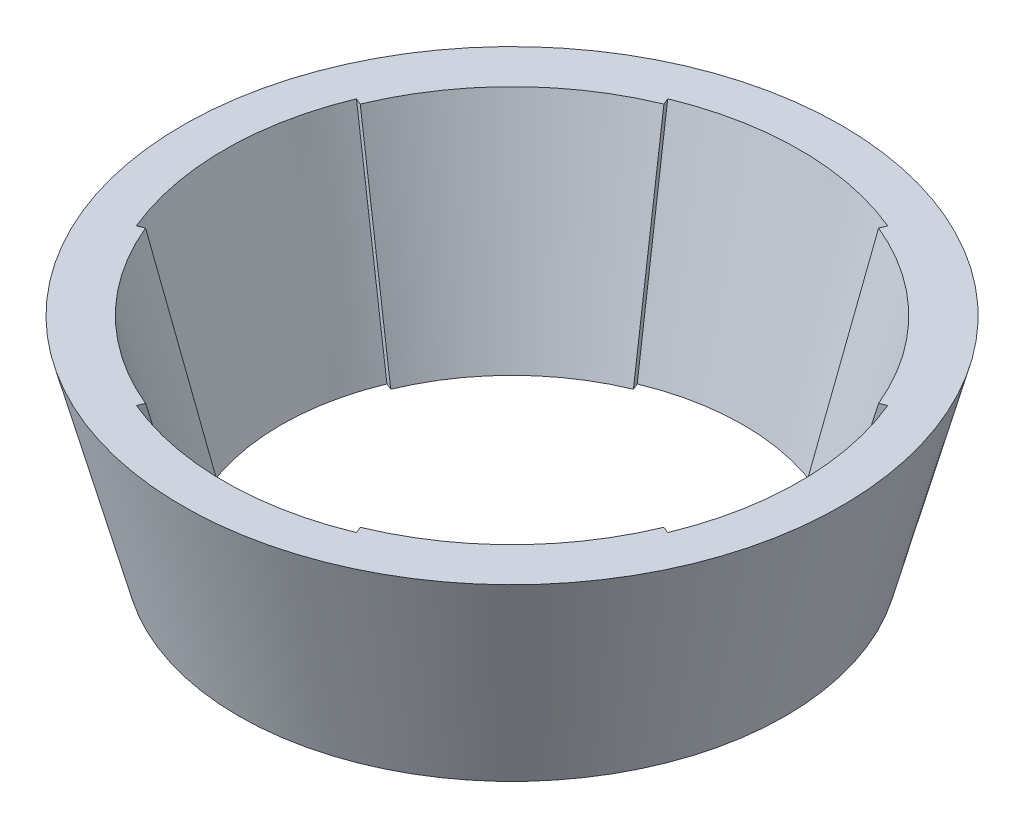
ISO-10303-21;
HEADER;
FILE_DESCRIPTION(('STEP AP214'),'2;1');
FILE_NAME('part.step','',(''),(''),'','','');
FILE_SCHEMA(('AUTOMOTIVE_DESIGN { 1 0 10303 214 1 1 1 1 }'));
ENDSEC;
DATA;
#1=APPLICATION_CONTEXT('core data for automotive mechanical design processes');
#2=APPLICATION_PROTOCOL_DEFINITION('international standard','automotive_design',2000,#1);
#3=PRODUCT_CONTEXT('',#1,'mechanical');
#4=PRODUCT('Part','Part','',(#3));
#5=PRODUCT_RELATED_PRODUCT_CATEGORY('part','',(#4));
#6=PRODUCT_DEFINITION_FORMATION('','',#4);
#7=PRODUCT_DEFINITION_CONTEXT('part definition',#1,'design');
#8=PRODUCT_DEFINITION('design','',#6,#7);
#9=PRODUCT_DEFINITION_SHAPE('','',#8);
#10=(LENGTH_UNIT() NAMED_UNIT(*) SI_UNIT(.MILLI.,.METRE.));
#11=(NAMED_UNIT(*) PLANE_ANGLE_UNIT() SI_UNIT($,.RADIAN.));
#12=(NAMED_UNIT(*) SI_UNIT($,.STERADIAN.) SOLID_ANGLE_UNIT());
#13=UNCERTAINTY_MEASURE_WITH_UNIT(LENGTH_MEASURE(1.E-05),#10,'distance_accuracy_value','');
#14=(GEOMETRIC_REPRESENTATION_CONTEXT(3) GLOBAL_UNCERTAINTY_ASSIGNED_CONTEXT((#13)) GLOBAL_UNIT_ASSIGNED_CONTEXT((#10,
#11,#12)) REPRESENTATION_CONTEXT('',''));
#15=CARTESIAN_POINT('',(0.,0.,0.));
#16=DIRECTION('',(0.,0.,1.));
#17=DIRECTION('',(1.,0.,0.));
#18=AXIS2_PLACEMENT_3D('',#15,#16,#17);
#19=CARTESIAN_POINT('',(49.53,0.,0.));
#20=DIRECTION('',(0.,-1.,0.));
#21=DIRECTION('',(0.,0.,-1.));
#22=AXIS2_PLACEMENT_3D('',#19,#20,#21);
#23=PLANE('',#22);
#24=CARTESIAN_POINT('',(0.,0.,0.));
#25=DIRECTION('',(0.,-1.,0.));
#26=DIRECTION('',(0.,0.,-1.));
#27=AXIS2_PLACEMENT_3D('',#24,#25,#26);
#28=CIRCLE('',#27,49.53);
#29=CARTESIAN_POINT('',(0.,0.,-49.53));
#30=VERTEX_POINT('',#29);
#31=EDGE_CURVE('E190',#30,#30,#28,.T.);
#32=ORIENTED_EDGE('',*,*,#31,.T.);
#33=EDGE_LOOP('',(#32));
#34=FACE_BOUND('',#33,.T.);
#35=CARTESIAN_POINT('',(0.,0.,0.));
#36=DIRECTION('',(0.,-1.,0.));
#37=DIRECTION('',(-1.,0.,0.));
#38=AXIS2_PLACEMENT_3D('',#35,#36,#37);
#39=CIRCLE('',#38,41.91);
#40=CARTESIAN_POINT('',(-16.0382626504205,0.,-38.7197912075482));
#41=VERTEX_POINT('',#40);
#42=CARTESIAN_POINT('',(16.0382626504214,0.,-38.7197912075479));
#43=VERTEX_POINT('',#42);
#44=EDGE_CURVE('E317',#41,#43,#39,.T.);
#45=ORIENTED_EDGE('',*,*,#44,.F.);
#46=DIRECTION('',(-0.382683432365081,0.,-0.923879532511291));
#47=VECTOR('',#46,1.);
#48=CARTESIAN_POINT('',(-15.5522546913169,0.,-37.5464642012589));
#49=LINE('',#48,#47);
#50=CARTESIAN_POINT('',(-15.5522546913169,0.,-37.5464642012589));
#51=VERTEX_POINT('',#50);
#52=EDGE_CURVE('E316',#51,#41,#49,.T.);
#53=ORIENTED_EDGE('',*,*,#52,.F.);
#54=CARTESIAN_POINT('',(0.,0.,0.));
#55=DIRECTION('',(0.,-1.,0.));
#56=DIRECTION('',(0.,0.,-1.));
#57=AXIS2_PLACEMENT_3D('',#54,#55,#56);
#58=CIRCLE('',#57,40.64);
#59=CARTESIAN_POINT('',(-37.5464642012587,0.,-15.5522546913173));
#60=VERTEX_POINT('',#59);
#61=EDGE_CURVE('E196',#60,#51,#58,.T.);
#62=ORIENTED_EDGE('',*,*,#61,.F.);
#63=DIRECTION('',(-0.923879532511287,0.,-0.382683432365091));
#64=VECTOR('',#63,1.);
#65=CARTESIAN_POINT('',(-37.5464642012587,0.,-15.5522546913173));
#66=LINE('',#65,#64);
#67=CARTESIAN_POINT('',(-38.719791207548,0.,-16.038262650421));
#68=VERTEX_POINT('',#67);
#69=EDGE_CURVE('E73',#60,#68,#66,.T.);
#70=ORIENTED_EDGE('',*,*,#69,.T.);
#71=CARTESIAN_POINT('',(0.,0.,0.));
#72=DIRECTION('',(0.,-1.,0.));
#73=DIRECTION('',(0.,0.,1.));
#74=AXIS2_PLACEMENT_3D('',#71,#72,#73);
#75=CIRCLE('',#74,41.91);
#76=CARTESIAN_POINT('',(-38.719791207548,0.,16.038262650421));
#77=VERTEX_POINT('',#76);
#78=EDGE_CURVE('E227',#77,#68,#75,.T.);
#79=ORIENTED_EDGE('',*,*,#78,.F.);
#80=DIRECTION('',(-0.923879532511287,0.,0.382683432365091));
#81=VECTOR('',#80,1.);
#82=CARTESIAN_POINT('',(-37.5464642012587,0.,15.5522546913173));
#83=LINE('',#82,#81);
#84=CARTESIAN_POINT('',(-37.5464642012587,0.,15.5522546913173));
#85=VERTEX_POINT('',#84);
#86=EDGE_CURVE('E215',#85,#77,#83,.T.);
#87=ORIENTED_EDGE('',*,*,#86,.F.);
#88=CARTESIAN_POINT('',(-15.5522546913174,0.,37.5464642012586));
#89=VERTEX_POINT('',#88);
#90=EDGE_CURVE('E57',#89,#85,#58,.T.);
#91=ORIENTED_EDGE('',*,*,#90,.F.);
#92=DIRECTION('',(-0.382683432365094,0.,0.923879532511285));
#93=VECTOR('',#92,1.);
#94=CARTESIAN_POINT('',(-15.5522546913174,0.,37.5464642012586));
#95=LINE('',#94,#93);
#96=CARTESIAN_POINT('',(-16.0382626504211,0.,38.719791207548));
#97=VERTEX_POINT('',#96);
#98=EDGE_CURVE('E231',#89,#97,#95,.T.);
#99=ORIENTED_EDGE('',*,*,#98,.T.);
#100=CARTESIAN_POINT('',(0.,0.,0.));
#101=DIRECTION('',(0.,-1.,0.));
#102=DIRECTION('',(1.,0.,0.));
#103=AXIS2_PLACEMENT_3D('',#100,#101,#102);
#104=CIRCLE('',#103,41.91);
#105=CARTESIAN_POINT('',(16.0382626504208,0.,38.7197912075481));
#106=VERTEX_POINT('',#105);
#107=EDGE_CURVE('E248',#106,#97,#104,.T.);
#108=ORIENTED_EDGE('',*,*,#107,.F.);
#109=DIRECTION('',(0.382683432365088,0.,0.923879532511288));
#110=VECTOR('',#109,1.);
#111=CARTESIAN_POINT('',(15.5522546913172,0.,37.5464642012588));
#112=LINE('',#111,#110);
#113=CARTESIAN_POINT('',(15.5522546913172,0.,37.5464642012588));
#114=VERTEX_POINT('',#113);
#115=EDGE_CURVE('E241',#114,#106,#112,.T.);
#116=ORIENTED_EDGE('',*,*,#115,.F.);
#117=CARTESIAN_POINT('',(37.5464642012587,0.,15.5522546913173));
#118=VERTEX_POINT('',#117);
#119=EDGE_CURVE('E13',#118,#114,#58,.T.);
#120=ORIENTED_EDGE('',*,*,#119,.F.);
#121=DIRECTION('',(0.923879532511287,0.,0.382683432365091));
#122=VECTOR('',#121,1.);
#123=CARTESIAN_POINT('',(37.5464642012587,0.,15.5522546913173));
#124=LINE('',#123,#122);
#125=CARTESIAN_POINT('',(38.719791207548,0.,16.038262650421));
#126=VERTEX_POINT('',#125);
#127=EDGE_CURVE('E255',#118,#126,#124,.T.);
#128=ORIENTED_EDGE('',*,*,#127,.T.);
#129=CARTESIAN_POINT('',(0.,0.,0.));
#130=DIRECTION('',(0.,-1.,0.));
#131=DIRECTION('',(0.,0.,-1.));
#132=AXIS2_PLACEMENT_3D('',#129,#130,#131);
#133=CIRCLE('',#132,41.91);
#134=CARTESIAN_POINT('',(38.719791207548,0.,-16.038262650421));
#135=VERTEX_POINT('',#134);
#136=EDGE_CURVE('E272',#135,#126,#133,.T.);
#137=ORIENTED_EDGE('',*,*,#136,.F.);
#138=DIRECTION('',(0.923879532511287,0.,-0.382683432365091));
#139=VECTOR('',#138,1.);
#140=CARTESIAN_POINT('',(37.5464642012587,0.,-15.5522546913173));
#141=LINE('',#140,#139);
#142=CARTESIAN_POINT('',(37.5464642012587,0.,-15.5522546913173));
#143=VERTEX_POINT('',#142);
#144=EDGE_CURVE('E264',#143,#135,#141,.T.);
#145=ORIENTED_EDGE('',*,*,#144,.F.);
#146=CARTESIAN_POINT('',(15.5522546913177,0.,-37.5464642012585));
#147=VERTEX_POINT('',#146);
#148=EDGE_CURVE('E58',#147,#143,#58,.T.);
#149=ORIENTED_EDGE('',*,*,#148,.F.);
#150=DIRECTION('',(0.3826834323651,0.,-0.923879532511283));
#151=VECTOR('',#150,1.);
#152=CARTESIAN_POINT('',(15.5522546913177,0.,-37.5464642012585));
#153=LINE('',#152,#151);
#154=EDGE_CURVE('E65',#147,#43,#153,.T.);
#155=ORIENTED_EDGE('',*,*,#154,.T.);
#156=EDGE_LOOP('',(#45,#53,#62,#70,#79,#87,#91,#99,#108,#116,#120,#128,#137,#145,#149,#155));
#157=FACE_BOUND('',#156,.T.);
#158=ADVANCED_FACE('F50',(#34,#157),#23,.T.);
#159=CARTESIAN_POINT('',(50.8488642316259,38.1,0.));
#160=DIRECTION('',(0.,1.,0.));
#161=DIRECTION('',(0.,0.,1.));
#162=AXIS2_PLACEMENT_3D('',#159,#160,#161);
#163=PLANE('',#162);
#164=CARTESIAN_POINT('',(0.,38.1,0.));
#165=DIRECTION('',(0.,-1.,0.));
#166=DIRECTION('',(0.,0.,-1.));
#167=AXIS2_PLACEMENT_3D('',#164,#165,#166);
#168=CIRCLE('',#167,59.7388642316259);
#169=CARTESIAN_POINT('',(0.,38.1,-59.7388642316259));
#170=VERTEX_POINT('',#169);
#171=EDGE_CURVE('E186',#170,#170,#168,.T.);
#172=ORIENTED_EDGE('',*,*,#171,.F.);
#173=EDGE_LOOP('',(#172));
#174=FACE_BOUND('',#173,.T.);
#175=CARTESIAN_POINT('',(0.,38.1,0.));
#176=DIRECTION('',(0.,-1.,0.));
#177=DIRECTION('',(0.,0.,-1.));
#178=AXIS2_PLACEMENT_3D('',#175,#176,#177);
#179=CIRCLE('',#178,50.8488642316259);
#180=CARTESIAN_POINT('',(-46.9782249150445,38.1,-19.4590178960251));
#181=VERTEX_POINT('',#180);
#182=CARTESIAN_POINT('',(-19.4590178960246,38.1,-46.9782249150447));
#183=VERTEX_POINT('',#182);
#184=EDGE_CURVE('E185',#181,#183,#179,.T.);
#185=ORIENTED_EDGE('',*,*,#184,.T.);
#186=DIRECTION('',(0.382683432365081,0.,0.923879532511291));
#187=VECTOR('',#186,1.);
#188=CARTESIAN_POINT('',(-19.9450258551283,38.1,-48.151551921334));
#189=LINE('',#188,#187);
#190=CARTESIAN_POINT('',(-19.9450258551283,38.1,-48.151551921334));
#191=VERTEX_POINT('',#190);
#192=EDGE_CURVE('E324',#191,#183,#189,.T.);
#193=ORIENTED_EDGE('',*,*,#192,.F.);
#194=CARTESIAN_POINT('',(0.,38.1,0.));
#195=DIRECTION('',(0.,-1.,0.));
#196=DIRECTION('',(-1.,0.,0.));
#197=AXIS2_PLACEMENT_3D('',#194,#195,#196);
#198=CIRCLE('',#197,52.118864231626);
#199=CARTESIAN_POINT('',(19.9450258551293,38.1,-48.1515519213336));
#200=VERTEX_POINT('',#199);
#201=EDGE_CURVE('E179',#191,#200,#198,.T.);
#202=ORIENTED_EDGE('',*,*,#201,.T.);
#203=DIRECTION('',(-0.3826834323651,0.,0.923879532511283));
#204=VECTOR('',#203,1.);
#205=CARTESIAN_POINT('',(19.9450258551293,38.1,-48.1515519213336));
#206=LINE('',#205,#204);
#207=CARTESIAN_POINT('',(19.4590178960256,38.1,-46.9782249150443));
#208=VERTEX_POINT('',#207);
#209=EDGE_CURVE('E165',#200,#208,#206,.T.);
#210=ORIENTED_EDGE('',*,*,#209,.T.);
#211=CARTESIAN_POINT('',(46.9782249150445,38.1,-19.4590178960251));
#212=VERTEX_POINT('',#211);
#213=EDGE_CURVE('E176',#208,#212,#179,.T.);
#214=ORIENTED_EDGE('',*,*,#213,.T.);
#215=DIRECTION('',(-0.923879532511287,0.,0.382683432365091));
#216=VECTOR('',#215,1.);
#217=CARTESIAN_POINT('',(48.1515519213338,38.1,-19.9450258551288));
#218=LINE('',#217,#216);
#219=CARTESIAN_POINT('',(48.1515519213338,38.1,-19.9450258551288));
#220=VERTEX_POINT('',#219);
#221=EDGE_CURVE('E261',#220,#212,#218,.T.);
#222=ORIENTED_EDGE('',*,*,#221,.F.);
#223=CARTESIAN_POINT('',(0.,38.1,0.));
#224=DIRECTION('',(0.,-1.,0.));
#225=DIRECTION('',(0.,0.,-1.));
#226=AXIS2_PLACEMENT_3D('',#223,#224,#225);
#227=CIRCLE('',#226,52.118864231626);
#228=CARTESIAN_POINT('',(48.1515519213338,38.1,19.9450258551288));
#229=VERTEX_POINT('',#228);
#230=EDGE_CURVE('E269',#220,#229,#227,.T.);
#231=ORIENTED_EDGE('',*,*,#230,.T.);
#232=DIRECTION('',(-0.923879532511287,0.,-0.382683432365091));
#233=VECTOR('',#232,1.);
#234=CARTESIAN_POINT('',(48.1515519213338,38.1,19.9450258551288));
#235=LINE('',#234,#233);
#236=CARTESIAN_POINT('',(46.9782249150444,38.1,19.4590178960251));
#237=VERTEX_POINT('',#236);
#238=EDGE_CURVE('E250',#229,#237,#235,.T.);
#239=ORIENTED_EDGE('',*,*,#238,.T.);
#240=CARTESIAN_POINT('',(19.4590178960249,38.1,46.9782249150445));
#241=VERTEX_POINT('',#240);
#242=EDGE_CURVE('E187',#237,#241,#179,.T.);
#243=ORIENTED_EDGE('',*,*,#242,.T.);
#244=DIRECTION('',(-0.382683432365088,0.,-0.923879532511288));
#245=VECTOR('',#244,1.);
#246=CARTESIAN_POINT('',(19.9450258551286,38.1,48.1515519213339));
#247=LINE('',#246,#245);
#248=CARTESIAN_POINT('',(19.9450258551286,38.1,48.1515519213339));
#249=VERTEX_POINT('',#248);
#250=EDGE_CURVE('E237',#249,#241,#247,.T.);
#251=ORIENTED_EDGE('',*,*,#250,.F.);
#252=CARTESIAN_POINT('',(0.,38.1,0.));
#253=DIRECTION('',(0.,-1.,0.));
#254=DIRECTION('',(1.,0.,0.));
#255=AXIS2_PLACEMENT_3D('',#252,#253,#254);
#256=CIRCLE('',#255,52.118864231626);
#257=CARTESIAN_POINT('',(-19.9450258551289,38.1,48.1515519213337));
#258=VERTEX_POINT('',#257);
#259=EDGE_CURVE('E246',#249,#258,#256,.T.);
#260=ORIENTED_EDGE('',*,*,#259,.T.);
#261=DIRECTION('',(0.382683432365094,0.,-0.923879532511285));
#262=VECTOR('',#261,1.);
#263=CARTESIAN_POINT('',(-19.9450258551289,38.1,48.1515519213337));
#264=LINE('',#263,#262);
#265=CARTESIAN_POINT('',(-19.4590178960253,38.1,46.9782249150444));
#266=VERTEX_POINT('',#265);
#267=EDGE_CURVE('E204',#258,#266,#264,.T.);
#268=ORIENTED_EDGE('',*,*,#267,.T.);
#269=CARTESIAN_POINT('',(-46.9782249150445,38.1,19.4590178960251));
#270=VERTEX_POINT('',#269);
#271=EDGE_CURVE('E188',#266,#270,#179,.T.);
#272=ORIENTED_EDGE('',*,*,#271,.T.);
#273=DIRECTION('',(0.923879532511287,0.,-0.382683432365091));
#274=VECTOR('',#273,1.);
#275=CARTESIAN_POINT('',(-48.1515519213338,38.1,19.9450258551288));
#276=LINE('',#275,#274);
#277=CARTESIAN_POINT('',(-48.1515519213338,38.1,19.9450258551288));
#278=VERTEX_POINT('',#277);
#279=EDGE_CURVE('E202',#278,#270,#276,.T.);
#280=ORIENTED_EDGE('',*,*,#279,.F.);
#281=CARTESIAN_POINT('',(0.,38.1,0.));
#282=DIRECTION('',(0.,-1.,0.));
#283=DIRECTION('',(0.,0.,1.));
#284=AXIS2_PLACEMENT_3D('',#281,#282,#283);
#285=CIRCLE('',#284,52.118864231626);
#286=CARTESIAN_POINT('',(-48.1515519213338,38.1,-19.9450258551288));
#287=VERTEX_POINT('',#286);
#288=EDGE_CURVE('E225',#278,#287,#285,.T.);
#289=ORIENTED_EDGE('',*,*,#288,.T.);
#290=DIRECTION('',(0.923879532511287,0.,0.382683432365091));
#291=VECTOR('',#290,1.);
#292=CARTESIAN_POINT('',(-48.1515519213338,38.1,-19.9450258551288));
#293=LINE('',#292,#291);
#294=EDGE_CURVE('E330',#287,#181,#293,.T.);
#295=ORIENTED_EDGE('',*,*,#294,.T.);
#296=EDGE_LOOP('',(#185,#193,#202,#210,#214,#222,#231,#239,#243,#251,#260,#268,#272,#280,#289,#295));
#297=FACE_BOUND('',#296,.T.);
#298=ADVANCED_FACE('F174',(#174,#297),#163,.T.);
#299=CARTESIAN_POINT('',(0.,38.1,0.));
#300=DIRECTION('',(0.,1.,0.));
#301=DIRECTION('',(0.,0.,1.));
#302=AXIS2_PLACEMENT_3D('',#299,#300,#301);
#303=CONICAL_SURFACE('',#302,50.8488642316259,0.261799387799153);
#304=ORIENTED_EDGE('',*,*,#61,.T.);
#305=DIRECTION('',(0.0990457605412868,-0.965925826289067,0.239117618394339));
#306=VECTOR('',#305,1.);
#307=CARTESIAN_POINT('',(-19.4590178960246,38.1,-46.9782249150447));
#308=LINE('',#307,#306);
#309=EDGE_CURVE('E311',#183,#51,#308,.T.);
#310=ORIENTED_EDGE('',*,*,#309,.F.);
#311=ORIENTED_EDGE('',*,*,#184,.F.);
#312=DIRECTION('',(0.239117618394338,-0.965925826289067,0.0990457605412893));
#313=VECTOR('',#312,1.);
#314=CARTESIAN_POINT('',(-46.9782249150445,38.1,-19.4590178960251));
#315=LINE('',#314,#313);
#316=EDGE_CURVE('E312',#181,#60,#315,.T.);
#317=ORIENTED_EDGE('',*,*,#316,.T.);
#318=EDGE_LOOP('',(#304,#310,#311,#317));
#319=FACE_BOUND('',#318,.T.);
#320=ADVANCED_FACE('F292',(#319),#303,.F.);
#321=ORIENTED_EDGE('',*,*,#90,.T.);
#322=DIRECTION('',(0.239117618394338,-0.965925826289067,-0.0990457605412893));
#323=VECTOR('',#322,1.);
#324=CARTESIAN_POINT('',(-46.9782249150445,38.1,19.4590178960251));
#325=LINE('',#324,#323);
#326=EDGE_CURVE('E212',#270,#85,#325,.T.);
#327=ORIENTED_EDGE('',*,*,#326,.F.);
#328=ORIENTED_EDGE('',*,*,#271,.F.);
#329=DIRECTION('',(0.0990457605412901,-0.965925826289067,-0.239117618394338));
#330=VECTOR('',#329,1.);
#331=CARTESIAN_POINT('',(-19.4590178960253,38.1,46.9782249150444));
#332=LINE('',#331,#330);
#333=EDGE_CURVE('E210',#266,#89,#332,.T.);
#334=ORIENTED_EDGE('',*,*,#333,.T.);
#335=EDGE_LOOP('',(#321,#327,#328,#334));
#336=FACE_BOUND('',#335,.T.);
#337=ADVANCED_FACE('F209',(#336),#303,.F.);
#338=ORIENTED_EDGE('',*,*,#119,.T.);
#339=DIRECTION('',(-0.0990457605412884,-0.965925826289067,-0.239117618394338));
#340=VECTOR('',#339,1.);
#341=CARTESIAN_POINT('',(19.4590178960249,38.1,46.9782249150445));
#342=LINE('',#341,#340);
#343=EDGE_CURVE('E239',#241,#114,#342,.T.);
#344=ORIENTED_EDGE('',*,*,#343,.F.);
#345=ORIENTED_EDGE('',*,*,#242,.F.);
#346=DIRECTION('',(-0.239117618394338,-0.965925826289067,-0.0990457605412893));
#347=VECTOR('',#346,1.);
#348=CARTESIAN_POINT('',(46.9782249150445,38.1,19.4590178960251));
#349=LINE('',#348,#347);
#350=EDGE_CURVE('E252',#237,#118,#349,.T.);
#351=ORIENTED_EDGE('',*,*,#350,.T.);
#352=EDGE_LOOP('',(#338,#344,#345,#351));
#353=FACE_BOUND('',#352,.T.);
#354=ADVANCED_FACE('F291',(#353),#303,.F.);
#355=DIRECTION('',(-0.0990457605412918,-0.965925826289067,0.239117618394337));
#356=VECTOR('',#355,1.);
#357=CARTESIAN_POINT('',(19.4590178960256,38.1,-46.9782249150443));
#358=LINE('',#357,#356);
#359=EDGE_CURVE('E162',#208,#147,#358,.T.);
#360=ORIENTED_EDGE('',*,*,#359,.T.);
#361=ORIENTED_EDGE('',*,*,#148,.T.);
#362=DIRECTION('',(-0.239117618394338,-0.965925826289067,0.0990457605412893));
#363=VECTOR('',#362,1.);
#364=CARTESIAN_POINT('',(46.9782249150445,38.1,-19.4590178960251));
#365=LINE('',#364,#363);
#366=EDGE_CURVE('E184',#212,#143,#365,.T.);
#367=ORIENTED_EDGE('',*,*,#366,.F.);
#368=ORIENTED_EDGE('',*,*,#213,.F.);
#369=EDGE_LOOP('',(#360,#361,#367,#368));
#370=FACE_BOUND('',#369,.T.);
#371=ADVANCED_FACE('F182',(#370),#303,.F.);
#372=CARTESIAN_POINT('',(0.,0.,0.));
#373=DIRECTION('',(0.,1.,0.));
#374=DIRECTION('',(0.,0.,1.));
#375=AXIS2_PLACEMENT_3D('',#372,#373,#374);
#376=CONICAL_SURFACE('',#375,49.53,0.261799387799153);
#377=ORIENTED_EDGE('',*,*,#171,.T.);
#378=EDGE_LOOP('',(#377));
#379=FACE_BOUND('',#378,.T.);
#380=ORIENTED_EDGE('',*,*,#31,.F.);
#381=EDGE_LOOP('',(#380));
#382=FACE_BOUND('',#381,.T.);
#383=ADVANCED_FACE('F279',(#379,#382),#376,.T.);
#384=CARTESIAN_POINT('',(0.,0.,0.));
#385=DIRECTION('',(0.,1.,0.));
#386=DIRECTION('',(0.,0.,1.));
#387=AXIS2_PLACEMENT_3D('',#384,#385,#386);
#388=CONICAL_SURFACE('',#387,41.91,0.261799387799153);
#389=DIRECTION('',(0.239117618394338,0.965925826289067,-0.0990457605412892));
#390=VECTOR('',#389,1.);
#391=CARTESIAN_POINT('',(38.719791207548,0.,-16.038262650421));
#392=LINE('',#391,#390);
#393=EDGE_CURVE('E266',#135,#220,#392,.T.);
#394=ORIENTED_EDGE('',*,*,#393,.F.);
#395=ORIENTED_EDGE('',*,*,#136,.T.);
#396=DIRECTION('',(0.239117618394338,0.965925826289067,0.0990457605412892));
#397=VECTOR('',#396,1.);
#398=CARTESIAN_POINT('',(38.719791207548,0.,16.038262650421));
#399=LINE('',#398,#397);
#400=EDGE_CURVE('E258',#126,#229,#399,.T.);
#401=ORIENTED_EDGE('',*,*,#400,.T.);
#402=ORIENTED_EDGE('',*,*,#230,.F.);
#403=EDGE_LOOP('',(#394,#395,#401,#402));
#404=FACE_BOUND('',#403,.T.);
#405=ADVANCED_FACE('F281',(#404),#388,.F.);
#406=CARTESIAN_POINT('',(0.,0.,0.));
#407=DIRECTION('',(0.382683432365091,0.,0.923879532511287));
#408=DIRECTION('',(0.923879532511287,0.,-0.382683432365091));
#409=AXIS2_PLACEMENT_3D('',#406,#407,#408);
#410=PLANE('',#409);
#411=ORIENTED_EDGE('',*,*,#221,.T.);
#412=ORIENTED_EDGE('',*,*,#366,.T.);
#413=ORIENTED_EDGE('',*,*,#144,.T.);
#414=ORIENTED_EDGE('',*,*,#393,.T.);
#415=EDGE_LOOP('',(#411,#412,#413,#414));
#416=FACE_BOUND('',#415,.T.);
#417=ADVANCED_FACE('F288',(#416),#410,.T.);
#418=CARTESIAN_POINT('',(0.,0.,0.));
#419=DIRECTION('',(-0.382683432365091,0.,0.923879532511287));
#420=DIRECTION('',(0.923879532511287,0.,0.382683432365091));
#421=AXIS2_PLACEMENT_3D('',#418,#419,#420);
#422=PLANE('',#421);
#423=ORIENTED_EDGE('',*,*,#238,.F.);
#424=ORIENTED_EDGE('',*,*,#400,.F.);
#425=ORIENTED_EDGE('',*,*,#127,.F.);
#426=ORIENTED_EDGE('',*,*,#350,.F.);
#427=EDGE_LOOP('',(#423,#424,#425,#426));
#428=FACE_BOUND('',#427,.T.);
#429=ADVANCED_FACE('F366',(#428),#422,.F.);
#430=CARTESIAN_POINT('',(0.,0.,0.));
#431=DIRECTION('',(0.,1.,0.));
#432=DIRECTION('',(-1.,0.,0.));
#433=AXIS2_PLACEMENT_3D('',#430,#431,#432);
#434=CONICAL_SURFACE('',#433,41.91,0.261799387799153);
#435=DIRECTION('',(0.0990457605412884,0.965925826289067,0.239117618394338));
#436=VECTOR('',#435,1.);
#437=CARTESIAN_POINT('',(16.0382626504208,0.,38.7197912075481));
#438=LINE('',#437,#436);
#439=EDGE_CURVE('E243',#106,#249,#438,.T.);
#440=ORIENTED_EDGE('',*,*,#439,.F.);
#441=ORIENTED_EDGE('',*,*,#107,.T.);
#442=DIRECTION('',(-0.09904576054129,0.965925826289067,0.239117618394337));
#443=VECTOR('',#442,1.);
#444=CARTESIAN_POINT('',(-16.0382626504211,0.,38.719791207548));
#445=LINE('',#444,#443);
#446=EDGE_CURVE('E234',#97,#258,#445,.T.);
#447=ORIENTED_EDGE('',*,*,#446,.T.);
#448=ORIENTED_EDGE('',*,*,#259,.F.);
#449=EDGE_LOOP('',(#440,#441,#447,#448));
#450=FACE_BOUND('',#449,.T.);
#451=ADVANCED_FACE('F362',(#450),#434,.F.);
#452=CARTESIAN_POINT('',(0.,0.,0.));
#453=DIRECTION('',(-0.923879532511288,0.,0.382683432365088));
#454=DIRECTION('',(0.382683432365088,0.,0.923879532511288));
#455=AXIS2_PLACEMENT_3D('',#452,#453,#454);
#456=PLANE('',#455);
#457=ORIENTED_EDGE('',*,*,#250,.T.);
#458=ORIENTED_EDGE('',*,*,#343,.T.);
#459=ORIENTED_EDGE('',*,*,#115,.T.);
#460=ORIENTED_EDGE('',*,*,#439,.T.);
#461=EDGE_LOOP('',(#457,#458,#459,#460));
#462=FACE_BOUND('',#461,.T.);
#463=ADVANCED_FACE('F358',(#462),#456,.T.);
#464=CARTESIAN_POINT('',(0.,0.,0.));
#465=DIRECTION('',(-0.923879532511285,0.,-0.382683432365094));
#466=DIRECTION('',(-0.382683432365094,0.,0.923879532511285));
#467=AXIS2_PLACEMENT_3D('',#464,#465,#466);
#468=PLANE('',#467);
#469=ORIENTED_EDGE('',*,*,#267,.F.);
#470=ORIENTED_EDGE('',*,*,#446,.F.);
#471=ORIENTED_EDGE('',*,*,#98,.F.);
#472=ORIENTED_EDGE('',*,*,#333,.F.);
#473=EDGE_LOOP('',(#469,#470,#471,#472));
#474=FACE_BOUND('',#473,.T.);
#475=ADVANCED_FACE('F355',(#474),#468,.F.);
#476=CARTESIAN_POINT('',(0.,0.,0.));
#477=DIRECTION('',(0.,1.,0.));
#478=DIRECTION('',(0.,0.,-1.));
#479=AXIS2_PLACEMENT_3D('',#476,#477,#478);
#480=CONICAL_SURFACE('',#479,41.91,0.261799387799153);
#481=DIRECTION('',(-0.239117618394338,0.965925826289067,0.0990457605412892));
#482=VECTOR('',#481,1.);
#483=CARTESIAN_POINT('',(-38.719791207548,0.,16.038262650421));
#484=LINE('',#483,#482);
#485=EDGE_CURVE('E217',#77,#278,#484,.T.);
#486=ORIENTED_EDGE('',*,*,#485,.F.);
#487=ORIENTED_EDGE('',*,*,#78,.T.);
#488=DIRECTION('',(-0.239117618394338,0.965925826289067,-0.0990457605412892));
#489=VECTOR('',#488,1.);
#490=CARTESIAN_POINT('',(-38.719791207548,0.,-16.038262650421));
#491=LINE('',#490,#489);
#492=EDGE_CURVE('E219',#68,#287,#491,.T.);
#493=ORIENTED_EDGE('',*,*,#492,.T.);
#494=ORIENTED_EDGE('',*,*,#288,.F.);
#495=EDGE_LOOP('',(#486,#487,#493,#494));
#496=FACE_BOUND('',#495,.T.);
#497=ADVANCED_FACE('F337',(#496),#480,.F.);
#498=CARTESIAN_POINT('',(0.,0.,0.));
#499=DIRECTION('',(-0.382683432365091,0.,-0.923879532511287));
#500=DIRECTION('',(-0.923879532511287,0.,0.382683432365091));
#501=AXIS2_PLACEMENT_3D('',#498,#499,#500);
#502=PLANE('',#501);
#503=ORIENTED_EDGE('',*,*,#279,.T.);
#504=ORIENTED_EDGE('',*,*,#326,.T.);
#505=ORIENTED_EDGE('',*,*,#86,.T.);
#506=ORIENTED_EDGE('',*,*,#485,.T.);
#507=EDGE_LOOP('',(#503,#504,#505,#506));
#508=FACE_BOUND('',#507,.T.);
#509=ADVANCED_FACE('F341',(#508),#502,.T.);
#510=CARTESIAN_POINT('',(0.,0.,0.));
#511=DIRECTION('',(0.382683432365091,0.,-0.923879532511287));
#512=DIRECTION('',(-0.923879532511287,0.,-0.382683432365091));
#513=AXIS2_PLACEMENT_3D('',#510,#511,#512);
#514=PLANE('',#513);
#515=ORIENTED_EDGE('',*,*,#294,.F.);
#516=ORIENTED_EDGE('',*,*,#492,.F.);
#517=ORIENTED_EDGE('',*,*,#69,.F.);
#518=ORIENTED_EDGE('',*,*,#316,.F.);
#519=EDGE_LOOP('',(#515,#516,#517,#518));
#520=FACE_BOUND('',#519,.T.);
#521=ADVANCED_FACE('F338',(#520),#514,.F.);
#522=CARTESIAN_POINT('',(0.,0.,0.));
#523=DIRECTION('',(0.,1.,0.));
#524=DIRECTION('',(1.,0.,0.));
#525=AXIS2_PLACEMENT_3D('',#522,#523,#524);
#526=CONICAL_SURFACE('',#525,41.91,0.261799387799153);
#527=DIRECTION('',(-0.0990457605412867,0.965925826289067,-0.239117618394339));
#528=VECTOR('',#527,1.);
#529=CARTESIAN_POINT('',(-16.0382626504205,0.,-38.7197912075482));
#530=LINE('',#529,#528);
#531=EDGE_CURVE('E321',#41,#191,#530,.T.);
#532=ORIENTED_EDGE('',*,*,#531,.F.);
#533=ORIENTED_EDGE('',*,*,#44,.T.);
#534=DIRECTION('',(0.0990457605412917,0.965925826289067,-0.239117618394337));
#535=VECTOR('',#534,1.);
#536=CARTESIAN_POINT('',(16.0382626504214,0.,-38.7197912075479));
#537=LINE('',#536,#535);
#538=EDGE_CURVE('E457',#43,#200,#537,.T.);
#539=ORIENTED_EDGE('',*,*,#538,.T.);
#540=ORIENTED_EDGE('',*,*,#201,.F.);
#541=EDGE_LOOP('',(#532,#533,#539,#540));
#542=FACE_BOUND('',#541,.T.);
#543=ADVANCED_FACE('F340',(#542),#526,.F.);
#544=CARTESIAN_POINT('',(0.,0.,0.));
#545=DIRECTION('',(0.923879532511291,0.,-0.382683432365081));
#546=DIRECTION('',(-0.382683432365081,0.,-0.923879532511291));
#547=AXIS2_PLACEMENT_3D('',#544,#545,#546);
#548=PLANE('',#547);
#549=ORIENTED_EDGE('',*,*,#192,.T.);
#550=ORIENTED_EDGE('',*,*,#309,.T.);
#551=ORIENTED_EDGE('',*,*,#52,.T.);
#552=ORIENTED_EDGE('',*,*,#531,.T.);
#553=EDGE_LOOP('',(#549,#550,#551,#552));
#554=FACE_BOUND('',#553,.T.);
#555=ADVANCED_FACE('F347',(#554),#548,.T.);
#556=CARTESIAN_POINT('',(0.,0.,0.));
#557=DIRECTION('',(0.923879532511283,0.,0.3826834323651));
#558=DIRECTION('',(0.3826834323651,0.,-0.923879532511283));
#559=AXIS2_PLACEMENT_3D('',#556,#557,#558);
#560=PLANE('',#559);
#561=ORIENTED_EDGE('',*,*,#209,.F.);
#562=ORIENTED_EDGE('',*,*,#538,.F.);
#563=ORIENTED_EDGE('',*,*,#154,.F.);
#564=ORIENTED_EDGE('',*,*,#359,.F.);
#565=EDGE_LOOP('',(#561,#562,#563,#564));
#566=FACE_BOUND('',#565,.T.);
#567=ADVANCED_FACE('F164',(#566),#560,.F.);
#568=CLOSED_SHELL('',(#158,#298,#320,#337,#354,#371,#383,#405,#417,#429,#451,#463,#475,#497,
#509,#521,#543,#555,#567));
#569=MANIFOLD_SOLID_BREP('B2',#568);
#570=ADVANCED_BREP_SHAPE_REPRESENTATION('',(#18,#569),#14);
#571=SHAPE_DEFINITION_REPRESENTATION(#9,#570);
ENDSEC;
END-ISO-10303-21;
